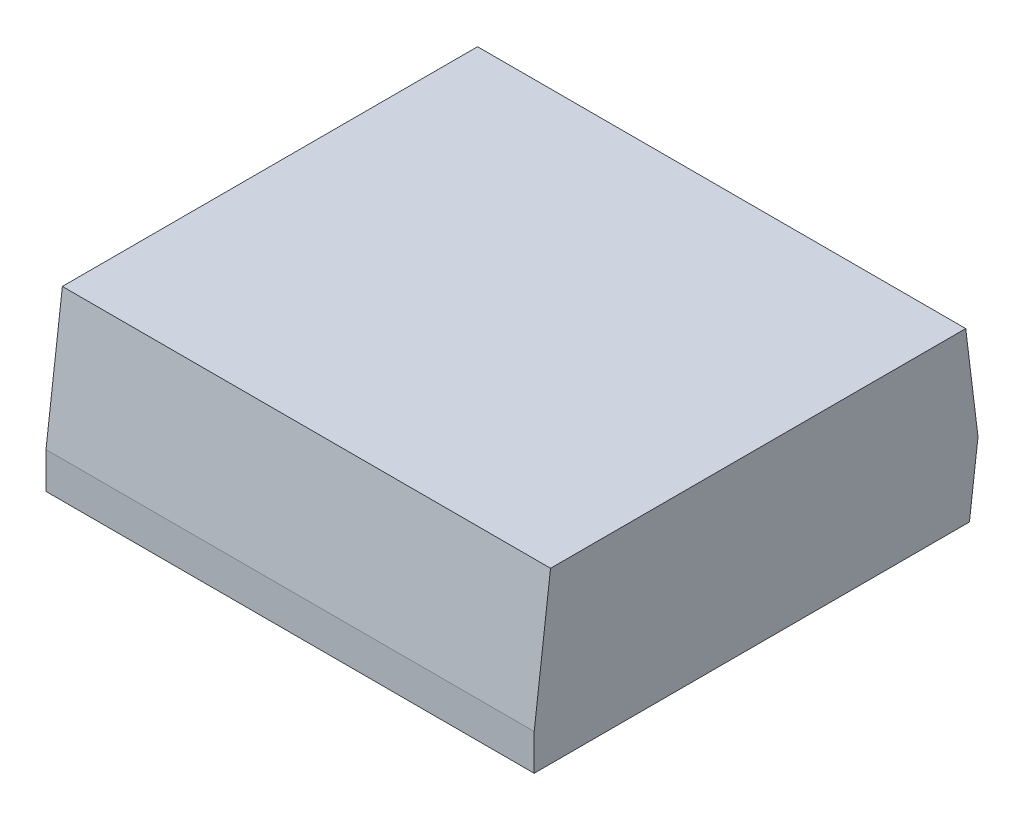
ISO-10303-21;
HEADER;
FILE_DESCRIPTION(('STEP AP214'),'2;1');
FILE_NAME('part.step','',(''),(''),'','','');
FILE_SCHEMA(('AUTOMOTIVE_DESIGN { 1 0 10303 214 1 1 1 1 }'));
ENDSEC;
DATA;
#1=APPLICATION_CONTEXT('core data for automotive mechanical design processes');
#2=APPLICATION_PROTOCOL_DEFINITION('international standard','automotive_design',2000,#1);
#3=PRODUCT_CONTEXT('',#1,'mechanical');
#4=PRODUCT('Part','Part','',(#3));
#5=PRODUCT_RELATED_PRODUCT_CATEGORY('part','',(#4));
#6=PRODUCT_DEFINITION_FORMATION('','',#4);
#7=PRODUCT_DEFINITION_CONTEXT('part definition',#1,'design');
#8=PRODUCT_DEFINITION('design','',#6,#7);
#9=PRODUCT_DEFINITION_SHAPE('','',#8);
#10=(LENGTH_UNIT() NAMED_UNIT(*) SI_UNIT(.MILLI.,.METRE.));
#11=(NAMED_UNIT(*) PLANE_ANGLE_UNIT() SI_UNIT($,.RADIAN.));
#12=(NAMED_UNIT(*) SI_UNIT($,.STERADIAN.) SOLID_ANGLE_UNIT());
#13=UNCERTAINTY_MEASURE_WITH_UNIT(LENGTH_MEASURE(1.E-05),#10,'distance_accuracy_value','');
#14=(GEOMETRIC_REPRESENTATION_CONTEXT(3) GLOBAL_UNCERTAINTY_ASSIGNED_CONTEXT((#13)) GLOBAL_UNIT_ASSIGNED_CONTEXT((#10,
#11,#12)) REPRESENTATION_CONTEXT('',''));
#15=CARTESIAN_POINT('',(0.,0.,0.));
#16=DIRECTION('',(0.,0.,1.));
#17=DIRECTION('',(1.,0.,0.));
#18=AXIS2_PLACEMENT_3D('',#15,#16,#17);
#19=CARTESIAN_POINT('',(-3.3,2.3,0.972373473797));
#20=DIRECTION('',(0.,1.,0.));
#21=DIRECTION('',(0.,0.,1.));
#22=AXIS2_PLACEMENT_3D('',#19,#20,#21);
#23=PLANE('',#22);
#24=DIRECTION('',(0.,0.,1.));
#25=VECTOR('',#24,1.);
#26=CARTESIAN_POINT('',(-3.3,2.3,1.008719290561));
#27=LINE('',#26,#25);
#28=CARTESIAN_POINT('',(-3.3,2.30000000000004,-1.8342408427813));
#29=VERTEX_POINT('',#28);
#30=CARTESIAN_POINT('',(-3.3,2.29999999999998,3.77898779037487));
#31=VERTEX_POINT('',#30);
#32=EDGE_CURVE('E76',#29,#31,#27,.T.);
#33=ORIENTED_EDGE('',*,*,#32,.T.);
#34=DIRECTION('',(1.,0.,0.));
#35=VECTOR('',#34,1.);
#36=CARTESIAN_POINT('',(-3.3,2.29999999999994,3.77898779037449));
#37=LINE('',#36,#35);
#38=CARTESIAN_POINT('',(3.3,2.29999999999997,3.77898779037475));
#39=VERTEX_POINT('',#38);
#40=EDGE_CURVE('E20',#39,#31,#37,.F.);
#41=ORIENTED_EDGE('',*,*,#40,.F.);
#42=DIRECTION('',(0.,0.,1.));
#43=VECTOR('',#42,1.);
#44=CARTESIAN_POINT('',(3.3,2.3,1.008719290561));
#45=LINE('',#44,#43);
#46=CARTESIAN_POINT('',(3.3,2.30000000000004,-1.8342408427813));
#47=VERTEX_POINT('',#46);
#48=EDGE_CURVE('E73',#47,#39,#45,.T.);
#49=ORIENTED_EDGE('',*,*,#48,.F.);
#50=DIRECTION('',(1.,0.,0.));
#51=VECTOR('',#50,1.);
#52=CARTESIAN_POINT('',(-3.3,2.30000000000007,-1.8342408427816));
#53=LINE('',#52,#51);
#54=EDGE_CURVE('E66',#29,#47,#53,.T.);
#55=ORIENTED_EDGE('',*,*,#54,.F.);
#56=EDGE_LOOP('',(#33,#41,#49,#55));
#57=FACE_BOUND('',#56,.T.);
#58=ADVANCED_FACE('F17',(#57),#23,.T.);
#59=CARTESIAN_POINT('',(-3.3,1.4,3.889493895187));
#60=DIRECTION('',(0.,0.121869343405041,0.992546151641335));
#61=DIRECTION('',(0.,-0.992546151641335,0.121869343405041));
#62=AXIS2_PLACEMENT_3D('',#59,#60,#61);
#63=PLANE('',#62);
#64=DIRECTION('',(0.,-0.992546151641337,0.121869343405024));
#65=VECTOR('',#64,1.);
#66=CARTESIAN_POINT('',(-3.3,2.3,3.778987790375));
#67=LINE('',#66,#65);
#68=CARTESIAN_POINT('',(-3.3,0.49999999999997,3.99999999999976));
#69=VERTEX_POINT('',#68);
#70=EDGE_CURVE('E99',#31,#69,#67,.T.);
#71=ORIENTED_EDGE('',*,*,#70,.T.);
#72=DIRECTION('',(1.,0.,0.));
#73=VECTOR('',#72,1.);
#74=CARTESIAN_POINT('',(-3.3,0.5,4.));
#75=LINE('',#74,#73);
#76=CARTESIAN_POINT('',(3.3,0.499999999999985,3.99999999999988));
#77=VERTEX_POINT('',#76);
#78=EDGE_CURVE('E83',#77,#69,#75,.F.);
#79=ORIENTED_EDGE('',*,*,#78,.F.);
#80=DIRECTION('',(0.,-0.992546151641337,0.121869343405024));
#81=VECTOR('',#80,1.);
#82=CARTESIAN_POINT('',(3.3,2.3,3.778987790375));
#83=LINE('',#82,#81);
#84=EDGE_CURVE('E80',#39,#77,#83,.T.);
#85=ORIENTED_EDGE('',*,*,#84,.F.);
#86=ORIENTED_EDGE('',*,*,#40,.T.);
#87=EDGE_LOOP('',(#71,#79,#85,#86));
#88=FACE_BOUND('',#87,.T.);
#89=ADVANCED_FACE('F81',(#88),#63,.T.);
#90=CARTESIAN_POINT('',(-3.3,1.625,-1.917120421391));
#91=DIRECTION('',(0.,0.121869343405041,-0.992546151641335));
#92=DIRECTION('',(0.,0.992546151641335,0.121869343405041));
#93=AXIS2_PLACEMENT_3D('',#90,#91,#92);
#94=PLANE('',#93);
#95=DIRECTION('',(0.,0.992546151641315,0.121869343405205));
#96=VECTOR('',#95,1.);
#97=CARTESIAN_POINT('',(-3.3,0.95,-2.));
#98=LINE('',#97,#96);
#99=CARTESIAN_POINT('',(-3.3,0.950000000000003,-2.00000000000017));
#100=VERTEX_POINT('',#99);
#101=EDGE_CURVE('E96',#100,#29,#98,.T.);
#102=ORIENTED_EDGE('',*,*,#101,.T.);
#103=ORIENTED_EDGE('',*,*,#54,.T.);
#104=DIRECTION('',(0.,0.992546151641315,0.121869343405205));
#105=VECTOR('',#104,1.);
#106=CARTESIAN_POINT('',(3.3,0.95,-2.));
#107=LINE('',#106,#105);
#108=CARTESIAN_POINT('',(3.3,0.950000000000003,-2.00000000000017));
#109=VERTEX_POINT('',#108);
#110=EDGE_CURVE('E86',#109,#47,#107,.T.);
#111=ORIENTED_EDGE('',*,*,#110,.F.);
#112=DIRECTION('',(1.,0.,0.));
#113=VECTOR('',#112,1.);
#114=CARTESIAN_POINT('',(-3.3,0.949999999999962,-2.00000000000031));
#115=LINE('',#114,#113);
#116=EDGE_CURVE('E107',#100,#109,#115,.T.);
#117=ORIENTED_EDGE('',*,*,#116,.F.);
#118=EDGE_LOOP('',(#102,#103,#111,#117));
#119=FACE_BOUND('',#118,.T.);
#120=ADVANCED_FACE('F127',(#119),#94,.T.);
#121=CARTESIAN_POINT('',(3.3,1.135917661071,1.008719290561));
#122=DIRECTION('',(1.,0.,0.));
#123=DIRECTION('',(0.,1.,0.));
#124=AXIS2_PLACEMENT_3D('',#121,#122,#123);
#125=PLANE('',#124);
#126=ORIENTED_EDGE('',*,*,#110,.T.);
#127=ORIENTED_EDGE('',*,*,#48,.T.);
#128=ORIENTED_EDGE('',*,*,#84,.T.);
#129=DIRECTION('',(0.,1.,0.));
#130=VECTOR('',#129,1.);
#131=CARTESIAN_POINT('',(3.3,0.255,4.));
#132=LINE('',#131,#130);
#133=CARTESIAN_POINT('',(3.3,0.00999999999999992,4.));
#134=VERTEX_POINT('',#133);
#135=EDGE_CURVE('E90',#134,#77,#132,.T.);
#136=ORIENTED_EDGE('',*,*,#135,.F.);
#137=DIRECTION('',(0.,0.,-1.));
#138=VECTOR('',#137,1.);
#139=CARTESIAN_POINT('',(3.3,0.01,1.057708743624));
#140=LINE('',#139,#138);
#141=CARTESIAN_POINT('',(3.3,0.00999999999997938,-1.88458251275117));
#142=VERTEX_POINT('',#141);
#143=EDGE_CURVE('E110',#142,#134,#140,.F.);
#144=ORIENTED_EDGE('',*,*,#143,.F.);
#145=DIRECTION('',(0.,0.992546151641335,-0.121869343405041));
#146=VECTOR('',#145,1.);
#147=CARTESIAN_POINT('',(3.3,0.48,-1.942291256376));
#148=LINE('',#147,#146);
#149=EDGE_CURVE('E103',#109,#142,#148,.F.);
#150=ORIENTED_EDGE('',*,*,#149,.F.);
#151=EDGE_LOOP('',(#126,#127,#128,#136,#144,#150));
#152=FACE_BOUND('',#151,.T.);
#153=ADVANCED_FACE('F88',(#152),#125,.T.);
#154=CARTESIAN_POINT('',(-3.3,0.255,4.));
#155=DIRECTION('',(0.,0.,1.));
#156=DIRECTION('',(1.,0.,0.));
#157=AXIS2_PLACEMENT_3D('',#154,#155,#156);
#158=PLANE('',#157);
#159=DIRECTION('',(0.,1.,0.));
#160=VECTOR('',#159,1.);
#161=CARTESIAN_POINT('',(-3.3,1.135917661071,4.));
#162=LINE('',#161,#160);
#163=CARTESIAN_POINT('',(-3.3,0.00999999999999992,4.));
#164=VERTEX_POINT('',#163);
#165=EDGE_CURVE('E101',#69,#164,#162,.F.);
#166=ORIENTED_EDGE('',*,*,#165,.T.);
#167=DIRECTION('',(1.,0.,0.));
#168=VECTOR('',#167,1.);
#169=CARTESIAN_POINT('',(-3.3,0.00999999999999962,4.));
#170=LINE('',#169,#168);
#171=EDGE_CURVE('E113',#134,#164,#170,.F.);
#172=ORIENTED_EDGE('',*,*,#171,.F.);
#173=ORIENTED_EDGE('',*,*,#135,.T.);
#174=ORIENTED_EDGE('',*,*,#78,.T.);
#175=EDGE_LOOP('',(#166,#172,#173,#174));
#176=FACE_BOUND('',#175,.T.);
#177=ADVANCED_FACE('F123',(#176),#158,.T.);
#178=CARTESIAN_POINT('',(-3.3,1.135917661071,1.008719290561));
#179=DIRECTION('',(1.,0.,0.));
#180=DIRECTION('',(0.,1.,0.));
#181=AXIS2_PLACEMENT_3D('',#178,#179,#180);
#182=PLANE('',#181);
#183=ORIENTED_EDGE('',*,*,#70,.F.);
#184=ORIENTED_EDGE('',*,*,#32,.F.);
#185=ORIENTED_EDGE('',*,*,#101,.F.);
#186=DIRECTION('',(0.,0.992546151641335,-0.121869343405041));
#187=VECTOR('',#186,1.);
#188=CARTESIAN_POINT('',(-3.3,0.48,-1.942291256376));
#189=LINE('',#188,#187);
#190=CARTESIAN_POINT('',(-3.3,0.00999999999997938,-1.88458251275117));
#191=VERTEX_POINT('',#190);
#192=EDGE_CURVE('E35',#191,#100,#189,.T.);
#193=ORIENTED_EDGE('',*,*,#192,.F.);
#194=DIRECTION('',(0.,0.,-1.));
#195=VECTOR('',#194,1.);
#196=CARTESIAN_POINT('',(-3.3,0.01,1.057708743624));
#197=LINE('',#196,#195);
#198=EDGE_CURVE('E26',#164,#191,#197,.T.);
#199=ORIENTED_EDGE('',*,*,#198,.F.);
#200=ORIENTED_EDGE('',*,*,#165,.F.);
#201=EDGE_LOOP('',(#183,#184,#185,#193,#199,#200));
#202=FACE_BOUND('',#201,.T.);
#203=ADVANCED_FACE('F121',(#202),#182,.F.);
#204=CARTESIAN_POINT('',(-3.3,0.48,-1.942291256376));
#205=DIRECTION('',(0.,-0.121869343405041,-0.992546151641335));
#206=DIRECTION('',(0.,0.992546151641335,-0.121869343405041));
#207=AXIS2_PLACEMENT_3D('',#204,#205,#206);
#208=PLANE('',#207);
#209=ORIENTED_EDGE('',*,*,#192,.T.);
#210=ORIENTED_EDGE('',*,*,#116,.T.);
#211=ORIENTED_EDGE('',*,*,#149,.T.);
#212=DIRECTION('',(1.,0.,0.));
#213=VECTOR('',#212,1.);
#214=CARTESIAN_POINT('',(-3.3,0.0100000000000004,-1.884582512751));
#215=LINE('',#214,#213);
#216=EDGE_CURVE('E11',#191,#142,#215,.T.);
#217=ORIENTED_EDGE('',*,*,#216,.F.);
#218=EDGE_LOOP('',(#209,#210,#211,#217));
#219=FACE_BOUND('',#218,.T.);
#220=ADVANCED_FACE('F125',(#219),#208,.T.);
#221=CARTESIAN_POINT('',(-3.3,0.01,1.057708743624));
#222=DIRECTION('',(0.,-1.,0.));
#223=DIRECTION('',(0.,0.,-1.));
#224=AXIS2_PLACEMENT_3D('',#221,#222,#223);
#225=PLANE('',#224);
#226=ORIENTED_EDGE('',*,*,#198,.T.);
#227=ORIENTED_EDGE('',*,*,#216,.T.);
#228=ORIENTED_EDGE('',*,*,#143,.T.);
#229=ORIENTED_EDGE('',*,*,#171,.T.);
#230=EDGE_LOOP('',(#226,#227,#228,#229));
#231=FACE_BOUND('',#230,.T.);
#232=ADVANCED_FACE('F118',(#231),#225,.T.);
#233=CLOSED_SHELL('',(#58,#89,#120,#153,#177,#203,#220,#232));
#234=MANIFOLD_SOLID_BREP('B1',#233);
#235=ADVANCED_BREP_SHAPE_REPRESENTATION('',(#18,#234),#14);
#236=SHAPE_DEFINITION_REPRESENTATION(#9,#235);
ENDSEC;
END-ISO-10303-21;
